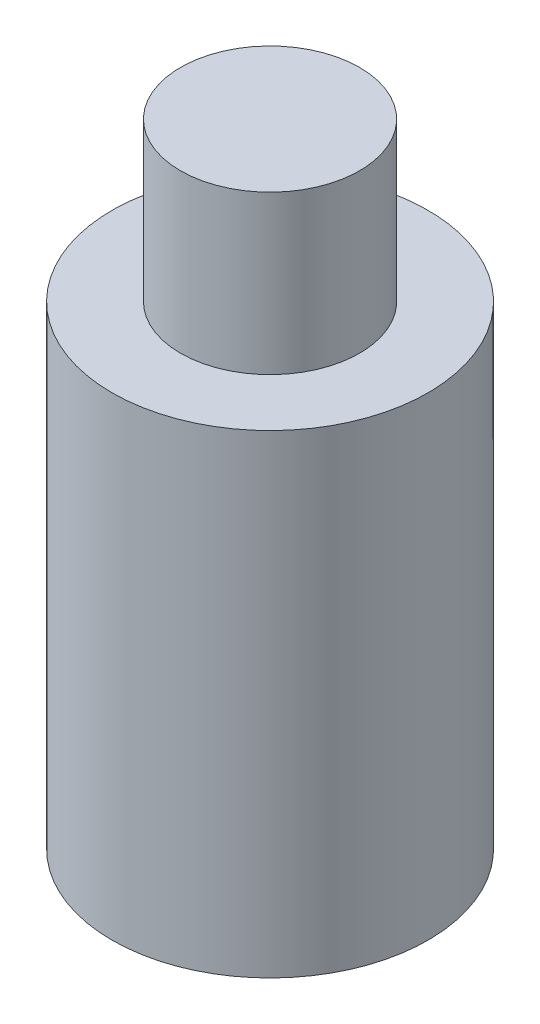
ISO-10303-21;
HEADER;
FILE_DESCRIPTION(('STEP AP214'),'2;1');
FILE_NAME('part.step','',(''),(''),'','','');
FILE_SCHEMA(('AUTOMOTIVE_DESIGN { 1 0 10303 214 1 1 1 1 }'));
ENDSEC;
DATA;
#1=APPLICATION_CONTEXT('core data for automotive mechanical design processes');
#2=APPLICATION_PROTOCOL_DEFINITION('international standard','automotive_design',2000,#1);
#3=PRODUCT_CONTEXT('',#1,'mechanical');
#4=PRODUCT('Part','Part','',(#3));
#5=PRODUCT_RELATED_PRODUCT_CATEGORY('part','',(#4));
#6=PRODUCT_DEFINITION_FORMATION('','',#4);
#7=PRODUCT_DEFINITION_CONTEXT('part definition',#1,'design');
#8=PRODUCT_DEFINITION('design','',#6,#7);
#9=PRODUCT_DEFINITION_SHAPE('','',#8);
#10=(LENGTH_UNIT() NAMED_UNIT(*) SI_UNIT(.MILLI.,.METRE.));
#11=(NAMED_UNIT(*) PLANE_ANGLE_UNIT() SI_UNIT($,.RADIAN.));
#12=(NAMED_UNIT(*) SI_UNIT($,.STERADIAN.) SOLID_ANGLE_UNIT());
#13=UNCERTAINTY_MEASURE_WITH_UNIT(LENGTH_MEASURE(1.E-05),#10,'distance_accuracy_value','');
#14=(GEOMETRIC_REPRESENTATION_CONTEXT(3) GLOBAL_UNCERTAINTY_ASSIGNED_CONTEXT((#13)) GLOBAL_UNIT_ASSIGNED_CONTEXT((#10,
#11,#12)) REPRESENTATION_CONTEXT('',''));
#15=CARTESIAN_POINT('',(0.,0.,0.));
#16=DIRECTION('',(0.,0.,1.));
#17=DIRECTION('',(1.,0.,0.));
#18=AXIS2_PLACEMENT_3D('',#15,#16,#17);
#19=CARTESIAN_POINT('',(21.5,15.,-39.));
#20=DIRECTION('',(0.,-1.,0.));
#21=DIRECTION('',(0.,0.,-1.));
#22=AXIS2_PLACEMENT_3D('',#19,#20,#21);
#23=CYLINDRICAL_SURFACE('',#22,1.7);
#24=CARTESIAN_POINT('',(21.5,15.,-39.));
#25=DIRECTION('',(0.,1.,0.));
#26=DIRECTION('',(0.,0.,1.));
#27=AXIS2_PLACEMENT_3D('',#24,#25,#26);
#28=CIRCLE('',#27,1.7);
#29=CARTESIAN_POINT('',(21.5,15.,-37.3));
#30=VERTEX_POINT('',#29);
#31=EDGE_CURVE('E11',#30,#30,#28,.T.);
#32=ORIENTED_EDGE('',*,*,#31,.F.);
#33=EDGE_LOOP('',(#32));
#34=FACE_BOUND('',#33,.T.);
#35=CARTESIAN_POINT('',(21.5,12.,-39.));
#36=DIRECTION('',(0.,1.,0.));
#37=DIRECTION('',(0.,0.,1.));
#38=AXIS2_PLACEMENT_3D('',#35,#36,#37);
#39=CIRCLE('',#38,1.7);
#40=CARTESIAN_POINT('',(21.5,12.,-37.3));
#41=VERTEX_POINT('',#40);
#42=EDGE_CURVE('E49',#41,#41,#39,.T.);
#43=ORIENTED_EDGE('',*,*,#42,.T.);
#44=EDGE_LOOP('',(#43));
#45=FACE_BOUND('',#44,.T.);
#46=ADVANCED_FACE('F50',(#34,#45),#23,.T.);
#47=CARTESIAN_POINT('',(21.5,15.,-39.));
#48=DIRECTION('',(0.,1.,0.));
#49=DIRECTION('',(0.,0.,1.));
#50=AXIS2_PLACEMENT_3D('',#47,#48,#49);
#51=PLANE('',#50);
#52=ORIENTED_EDGE('',*,*,#31,.T.);
#53=EDGE_LOOP('',(#52));
#54=FACE_BOUND('',#53,.T.);
#55=ADVANCED_FACE('F67',(#54),#51,.T.);
#56=CARTESIAN_POINT('',(21.5,12.,-39.));
#57=DIRECTION('',(0.,1.,0.));
#58=DIRECTION('',(0.,0.,1.));
#59=AXIS2_PLACEMENT_3D('',#56,#57,#58);
#60=PLANE('',#59);
#61=ORIENTED_EDGE('',*,*,#42,.F.);
#62=EDGE_LOOP('',(#61));
#63=FACE_BOUND('',#62,.T.);
#64=ADVANCED_FACE('F62',(#63),#60,.F.);
#65=CLOSED_SHELL('',(#46,#55,#64));
#66=MANIFOLD_SOLID_BREP('B2',#65);
#67=CARTESIAN_POINT('',(21.5,12.,-39.));
#68=DIRECTION('',(0.,1.,0.));
#69=DIRECTION('',(0.,0.,1.));
#70=AXIS2_PLACEMENT_3D('',#67,#68,#69);
#71=PLANE('',#70);
#72=CARTESIAN_POINT('',(21.5,12.,-39.));
#73=DIRECTION('',(0.,1.,0.));
#74=DIRECTION('',(0.,0.,1.));
#75=AXIS2_PLACEMENT_3D('',#72,#73,#74);
#76=CIRCLE('',#75,3.);
#77=CARTESIAN_POINT('',(21.5,12.,-36.));
#78=VERTEX_POINT('',#77);
#79=EDGE_CURVE('E46',#78,#78,#76,.T.);
#80=ORIENTED_EDGE('',*,*,#79,.T.);
#81=EDGE_LOOP('',(#80));
#82=FACE_BOUND('',#81,.T.);
#83=CARTESIAN_POINT('',(21.5,12.,-39.));
#84=DIRECTION('',(0.,1.,0.));
#85=DIRECTION('',(0.,0.,1.));
#86=AXIS2_PLACEMENT_3D('',#83,#84,#85);
#87=CIRCLE('',#86,1.7);
#88=CARTESIAN_POINT('',(21.5,12.,-37.3));
#89=VERTEX_POINT('',#88);
#90=EDGE_CURVE('E108',#89,#89,#87,.T.);
#91=ORIENTED_EDGE('',*,*,#90,.F.);
#92=EDGE_LOOP('',(#91));
#93=FACE_BOUND('',#92,.T.);
#94=ADVANCED_FACE('F95',(#82,#93),#71,.T.);
#95=CARTESIAN_POINT('',(21.5,3.,-39.));
#96=DIRECTION('',(0.,1.,0.));
#97=DIRECTION('',(0.,0.,1.));
#98=AXIS2_PLACEMENT_3D('',#95,#96,#97);
#99=PLANE('',#98);
#100=CARTESIAN_POINT('',(21.5,3.,-39.));
#101=DIRECTION('',(0.,1.,0.));
#102=DIRECTION('',(0.,0.,1.));
#103=AXIS2_PLACEMENT_3D('',#100,#101,#102);
#104=CIRCLE('',#103,3.);
#105=CARTESIAN_POINT('',(21.5,3.,-36.));
#106=VERTEX_POINT('',#105);
#107=EDGE_CURVE('E96',#106,#106,#104,.T.);
#108=ORIENTED_EDGE('',*,*,#107,.F.);
#109=EDGE_LOOP('',(#108));
#110=FACE_BOUND('',#109,.T.);
#111=CARTESIAN_POINT('',(21.5,3.,-39.));
#112=DIRECTION('',(0.,1.,0.));
#113=DIRECTION('',(0.,0.,1.));
#114=AXIS2_PLACEMENT_3D('',#111,#112,#113);
#115=CIRCLE('',#114,1.7);
#116=CARTESIAN_POINT('',(21.5,3.,-37.3));
#117=VERTEX_POINT('',#116);
#118=EDGE_CURVE('E106',#117,#117,#115,.T.);
#119=ORIENTED_EDGE('',*,*,#118,.T.);
#120=EDGE_LOOP('',(#119));
#121=FACE_BOUND('',#120,.T.);
#122=ADVANCED_FACE('F123',(#110,#121),#99,.F.);
#123=CARTESIAN_POINT('',(21.5,12.,-39.));
#124=DIRECTION('',(0.,-1.,0.));
#125=DIRECTION('',(0.,0.,-1.));
#126=AXIS2_PLACEMENT_3D('',#123,#124,#125);
#127=CYLINDRICAL_SURFACE('',#126,3.);
#128=ORIENTED_EDGE('',*,*,#79,.F.);
#129=EDGE_LOOP('',(#128));
#130=FACE_BOUND('',#129,.T.);
#131=ORIENTED_EDGE('',*,*,#107,.T.);
#132=EDGE_LOOP('',(#131));
#133=FACE_BOUND('',#132,.T.);
#134=ADVANCED_FACE('F92',(#130,#133),#127,.T.);
#135=CARTESIAN_POINT('',(21.5,12.,-39.));
#136=DIRECTION('',(0.,-1.,0.));
#137=DIRECTION('',(0.,0.,-1.));
#138=AXIS2_PLACEMENT_3D('',#135,#136,#137);
#139=CYLINDRICAL_SURFACE('',#138,1.7);
#140=ORIENTED_EDGE('',*,*,#90,.T.);
#141=EDGE_LOOP('',(#140));
#142=FACE_BOUND('',#141,.T.);
#143=ORIENTED_EDGE('',*,*,#118,.F.);
#144=EDGE_LOOP('',(#143));
#145=FACE_BOUND('',#144,.T.);
#146=ADVANCED_FACE('F120',(#142,#145),#139,.F.);
#147=CLOSED_SHELL('',(#94,#122,#134,#146));
#148=MANIFOLD_SOLID_BREP('B6',#147);
#149=ADVANCED_BREP_SHAPE_REPRESENTATION('',(#18,#66,#148),#14);
#150=SHAPE_DEFINITION_REPRESENTATION(#9,#149);
ENDSEC;
END-ISO-10303-21;
